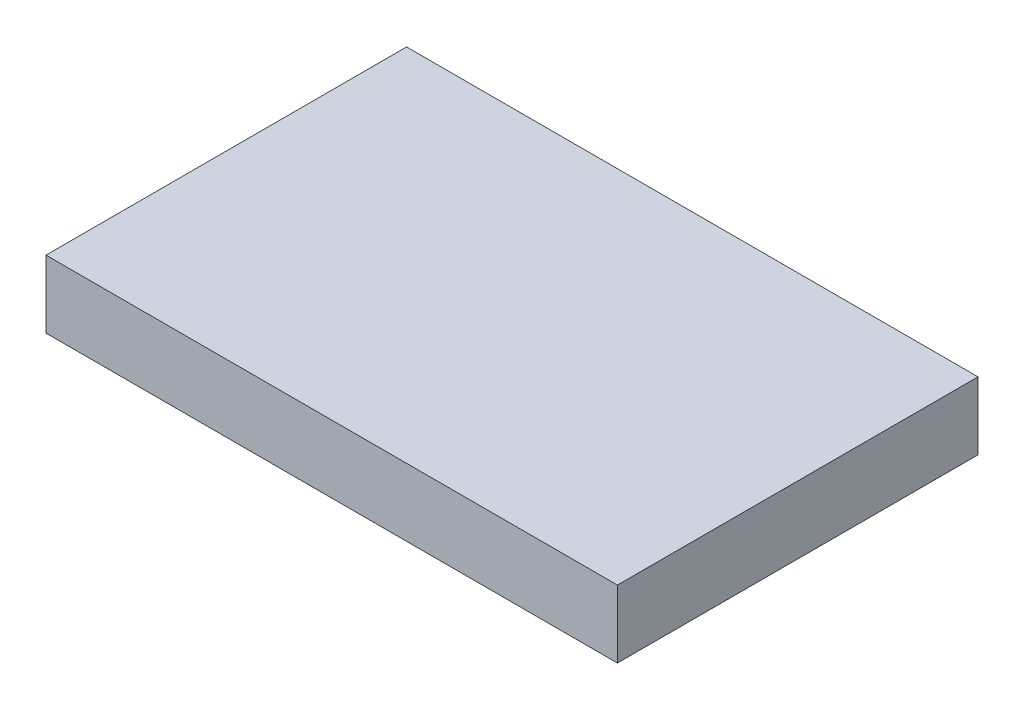
ISO-10303-21;
HEADER;
FILE_DESCRIPTION(('STEP AP214'),'2;1');
FILE_NAME('part.step','',(''),(''),'','','');
FILE_SCHEMA(('AUTOMOTIVE_DESIGN { 1 0 10303 214 1 1 1 1 }'));
ENDSEC;
DATA;
#1=APPLICATION_CONTEXT('core data for automotive mechanical design processes');
#2=APPLICATION_PROTOCOL_DEFINITION('international standard','automotive_design',2000,#1);
#3=PRODUCT_CONTEXT('',#1,'mechanical');
#4=PRODUCT('Part','Part','',(#3));
#5=PRODUCT_RELATED_PRODUCT_CATEGORY('part','',(#4));
#6=PRODUCT_DEFINITION_FORMATION('','',#4);
#7=PRODUCT_DEFINITION_CONTEXT('part definition',#1,'design');
#8=PRODUCT_DEFINITION('design','',#6,#7);
#9=PRODUCT_DEFINITION_SHAPE('','',#8);
#10=(LENGTH_UNIT() NAMED_UNIT(*) SI_UNIT(.MILLI.,.METRE.));
#11=(NAMED_UNIT(*) PLANE_ANGLE_UNIT() SI_UNIT($,.RADIAN.));
#12=(NAMED_UNIT(*) SI_UNIT($,.STERADIAN.) SOLID_ANGLE_UNIT());
#13=UNCERTAINTY_MEASURE_WITH_UNIT(LENGTH_MEASURE(1.E-05),#10,'distance_accuracy_value','');
#14=(GEOMETRIC_REPRESENTATION_CONTEXT(3) GLOBAL_UNCERTAINTY_ASSIGNED_CONTEXT((#13)) GLOBAL_UNIT_ASSIGNED_CONTEXT((#10,
#11,#12)) REPRESENTATION_CONTEXT('',''));
#15=CARTESIAN_POINT('',(0.,0.,0.));
#16=DIRECTION('',(0.,0.,1.));
#17=DIRECTION('',(1.,0.,0.));
#18=AXIS2_PLACEMENT_3D('',#15,#16,#17);
#19=CARTESIAN_POINT('',(0.,-12.7,0.));
#20=DIRECTION('',(-1.,0.,0.));
#21=DIRECTION('',(0.,0.,1.));
#22=AXIS2_PLACEMENT_3D('',#19,#20,#21);
#23=PLANE('',#22);
#24=DIRECTION('',(0.,0.,1.));
#25=VECTOR('',#24,1.);
#26=CARTESIAN_POINT('',(0.,0.,0.));
#27=LINE('',#26,#25);
#28=CARTESIAN_POINT('',(0.,0.,-67.7798712351318));
#29=VERTEX_POINT('',#28);
#30=CARTESIAN_POINT('',(0.,0.,0.));
#31=VERTEX_POINT('',#30);
#32=EDGE_CURVE('E95',#29,#31,#27,.T.);
#33=ORIENTED_EDGE('',*,*,#32,.F.);
#34=DIRECTION('',(0.,1.,0.));
#35=VECTOR('',#34,1.);
#36=CARTESIAN_POINT('',(0.,-12.7,-67.7798712351318));
#37=LINE('',#36,#35);
#38=CARTESIAN_POINT('',(0.,-12.7,-67.7798712351318));
#39=VERTEX_POINT('',#38);
#40=EDGE_CURVE('E11',#39,#29,#37,.T.);
#41=ORIENTED_EDGE('',*,*,#40,.F.);
#42=DIRECTION('',(0.,0.,1.));
#43=VECTOR('',#42,1.);
#44=CARTESIAN_POINT('',(0.,-12.7,0.));
#45=LINE('',#44,#43);
#46=CARTESIAN_POINT('',(0.,-12.7,0.));
#47=VERTEX_POINT('',#46);
#48=EDGE_CURVE('E89',#39,#47,#45,.T.);
#49=ORIENTED_EDGE('',*,*,#48,.T.);
#50=DIRECTION('',(0.,1.,0.));
#51=VECTOR('',#50,1.);
#52=CARTESIAN_POINT('',(0.,-12.7,0.));
#53=LINE('',#52,#51);
#54=EDGE_CURVE('E34',#47,#31,#53,.T.);
#55=ORIENTED_EDGE('',*,*,#54,.T.);
#56=EDGE_LOOP('',(#33,#41,#49,#55));
#57=FACE_BOUND('',#56,.T.);
#58=ADVANCED_FACE('F31',(#57),#23,.T.);
#59=CARTESIAN_POINT('',(0.,-12.7,-67.7798712351318));
#60=DIRECTION('',(0.,0.,-1.));
#61=DIRECTION('',(-1.,0.,0.));
#62=AXIS2_PLACEMENT_3D('',#59,#60,#61);
#63=PLANE('',#62);
#64=DIRECTION('',(-1.,0.,0.));
#65=VECTOR('',#64,1.);
#66=CARTESIAN_POINT('',(0.,0.,-67.7798712351318));
#67=LINE('',#66,#65);
#68=CARTESIAN_POINT('',(107.413416435179,0.,-67.7798712351318));
#69=VERTEX_POINT('',#68);
#70=EDGE_CURVE('E91',#69,#29,#67,.T.);
#71=ORIENTED_EDGE('',*,*,#70,.F.);
#72=DIRECTION('',(0.,1.,0.));
#73=VECTOR('',#72,1.);
#74=CARTESIAN_POINT('',(107.413416435179,-12.7,-67.7798712351318));
#75=LINE('',#74,#73);
#76=CARTESIAN_POINT('',(107.413416435179,-12.7,-67.7798712351318));
#77=VERTEX_POINT('',#76);
#78=EDGE_CURVE('E40',#77,#69,#75,.T.);
#79=ORIENTED_EDGE('',*,*,#78,.F.);
#80=DIRECTION('',(-1.,0.,0.));
#81=VECTOR('',#80,1.);
#82=CARTESIAN_POINT('',(0.,-12.7,-67.7798712351318));
#83=LINE('',#82,#81);
#84=EDGE_CURVE('E86',#77,#39,#83,.T.);
#85=ORIENTED_EDGE('',*,*,#84,.T.);
#86=ORIENTED_EDGE('',*,*,#40,.T.);
#87=EDGE_LOOP('',(#71,#79,#85,#86));
#88=FACE_BOUND('',#87,.T.);
#89=ADVANCED_FACE('F105',(#88),#63,.T.);
#90=CARTESIAN_POINT('',(107.413416435179,-12.7,0.));
#91=DIRECTION('',(1.,0.,0.));
#92=DIRECTION('',(0.,0.,-1.));
#93=AXIS2_PLACEMENT_3D('',#90,#91,#92);
#94=PLANE('',#93);
#95=DIRECTION('',(0.,0.,-1.));
#96=VECTOR('',#95,1.);
#97=CARTESIAN_POINT('',(107.413416435179,0.,0.));
#98=LINE('',#97,#96);
#99=CARTESIAN_POINT('',(107.413416435179,0.,0.));
#100=VERTEX_POINT('',#99);
#101=EDGE_CURVE('E81',#100,#69,#98,.T.);
#102=ORIENTED_EDGE('',*,*,#101,.F.);
#103=DIRECTION('',(0.,1.,0.));
#104=VECTOR('',#103,1.);
#105=CARTESIAN_POINT('',(107.413416435179,-12.7,0.));
#106=LINE('',#105,#104);
#107=CARTESIAN_POINT('',(107.413416435179,-12.7,0.));
#108=VERTEX_POINT('',#107);
#109=EDGE_CURVE('E76',#108,#100,#106,.T.);
#110=ORIENTED_EDGE('',*,*,#109,.F.);
#111=DIRECTION('',(0.,0.,-1.));
#112=VECTOR('',#111,1.);
#113=CARTESIAN_POINT('',(107.413416435179,-12.7,0.));
#114=LINE('',#113,#112);
#115=EDGE_CURVE('E79',#108,#77,#114,.T.);
#116=ORIENTED_EDGE('',*,*,#115,.T.);
#117=ORIENTED_EDGE('',*,*,#78,.T.);
#118=EDGE_LOOP('',(#102,#110,#116,#117));
#119=FACE_BOUND('',#118,.T.);
#120=ADVANCED_FACE('F78',(#119),#94,.T.);
#121=CARTESIAN_POINT('',(0.,-12.7,0.));
#122=DIRECTION('',(0.,0.,1.));
#123=DIRECTION('',(1.,0.,0.));
#124=AXIS2_PLACEMENT_3D('',#121,#122,#123);
#125=PLANE('',#124);
#126=DIRECTION('',(1.,0.,0.));
#127=VECTOR('',#126,1.);
#128=CARTESIAN_POINT('',(0.,0.,0.));
#129=LINE('',#128,#127);
#130=EDGE_CURVE('E98',#31,#100,#129,.T.);
#131=ORIENTED_EDGE('',*,*,#130,.F.);
#132=ORIENTED_EDGE('',*,*,#54,.F.);
#133=DIRECTION('',(1.,0.,0.));
#134=VECTOR('',#133,1.);
#135=CARTESIAN_POINT('',(0.,-12.7,0.));
#136=LINE('',#135,#134);
#137=EDGE_CURVE('E85',#47,#108,#136,.T.);
#138=ORIENTED_EDGE('',*,*,#137,.T.);
#139=ORIENTED_EDGE('',*,*,#109,.T.);
#140=EDGE_LOOP('',(#131,#132,#138,#139));
#141=FACE_BOUND('',#140,.T.);
#142=ADVANCED_FACE('F88',(#141),#125,.T.);
#143=CARTESIAN_POINT('',(0.,-12.7,-67.7798712351318));
#144=DIRECTION('',(0.,-1.,0.));
#145=DIRECTION('',(0.,0.,-1.));
#146=AXIS2_PLACEMENT_3D('',#143,#144,#145);
#147=PLANE('',#146);
#148=ORIENTED_EDGE('',*,*,#48,.F.);
#149=ORIENTED_EDGE('',*,*,#84,.F.);
#150=ORIENTED_EDGE('',*,*,#115,.F.);
#151=ORIENTED_EDGE('',*,*,#137,.F.);
#152=EDGE_LOOP('',(#148,#149,#150,#151));
#153=FACE_BOUND('',#152,.T.);
#154=ADVANCED_FACE('F84',(#153),#147,.T.);
#155=CARTESIAN_POINT('',(0.,0.,-67.7798712351318));
#156=DIRECTION('',(0.,-1.,0.));
#157=DIRECTION('',(0.,0.,-1.));
#158=AXIS2_PLACEMENT_3D('',#155,#156,#157);
#159=PLANE('',#158);
#160=ORIENTED_EDGE('',*,*,#32,.T.);
#161=ORIENTED_EDGE('',*,*,#130,.T.);
#162=ORIENTED_EDGE('',*,*,#101,.T.);
#163=ORIENTED_EDGE('',*,*,#70,.T.);
#164=EDGE_LOOP('',(#160,#161,#162,#163));
#165=FACE_BOUND('',#164,.T.);
#166=ADVANCED_FACE('F104',(#165),#159,.F.);
#167=CLOSED_SHELL('',(#58,#89,#120,#142,#154,#166));
#168=MANIFOLD_SOLID_BREP('B2',#167);
#169=ADVANCED_BREP_SHAPE_REPRESENTATION('',(#18,#168),#14);
#170=SHAPE_DEFINITION_REPRESENTATION(#9,#169);
ENDSEC;
END-ISO-10303-21;
